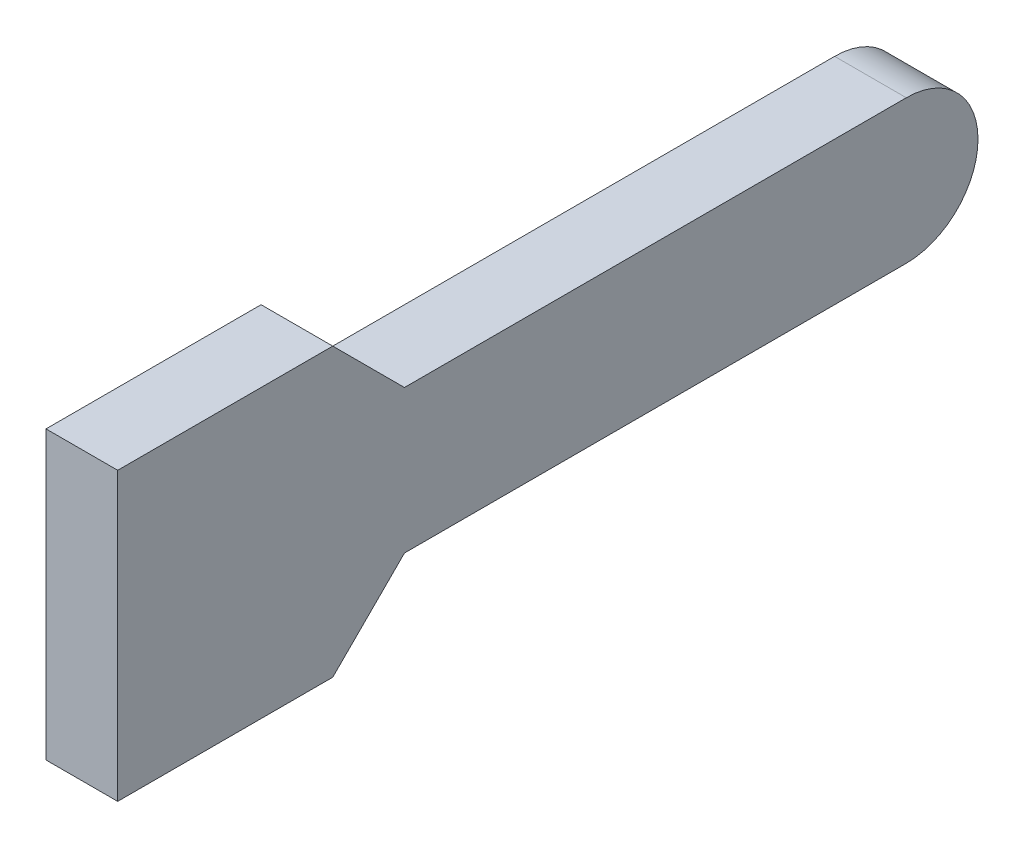
ISO-10303-21;
HEADER;
FILE_DESCRIPTION(('STEP AP214'),'2;1');
FILE_NAME('part.step','',(''),(''),'','','');
FILE_SCHEMA(('AUTOMOTIVE_DESIGN { 1 0 10303 214 1 1 1 1 }'));
ENDSEC;
DATA;
#1=APPLICATION_CONTEXT('core data for automotive mechanical design processes');
#2=APPLICATION_PROTOCOL_DEFINITION('international standard','automotive_design',2000,#1);
#3=PRODUCT_CONTEXT('',#1,'mechanical');
#4=PRODUCT('Part','Part','',(#3));
#5=PRODUCT_RELATED_PRODUCT_CATEGORY('part','',(#4));
#6=PRODUCT_DEFINITION_FORMATION('','',#4);
#7=PRODUCT_DEFINITION_CONTEXT('part definition',#1,'design');
#8=PRODUCT_DEFINITION('design','',#6,#7);
#9=PRODUCT_DEFINITION_SHAPE('','',#8);
#10=(LENGTH_UNIT() NAMED_UNIT(*) SI_UNIT(.MILLI.,.METRE.));
#11=(NAMED_UNIT(*) PLANE_ANGLE_UNIT() SI_UNIT($,.RADIAN.));
#12=(NAMED_UNIT(*) SI_UNIT($,.STERADIAN.) SOLID_ANGLE_UNIT());
#13=UNCERTAINTY_MEASURE_WITH_UNIT(LENGTH_MEASURE(1.E-05),#10,'distance_accuracy_value','');
#14=(GEOMETRIC_REPRESENTATION_CONTEXT(3) GLOBAL_UNCERTAINTY_ASSIGNED_CONTEXT((#13)) GLOBAL_UNIT_ASSIGNED_CONTEXT((#10,
#11,#12)) REPRESENTATION_CONTEXT('',''));
#15=CARTESIAN_POINT('',(0.,0.,0.));
#16=DIRECTION('',(0.,0.,1.));
#17=DIRECTION('',(1.,0.,0.));
#18=AXIS2_PLACEMENT_3D('',#15,#16,#17);
#19=CARTESIAN_POINT('',(-0.25,0.,-1.67367553520706));
#20=DIRECTION('',(1.,0.,0.));
#21=DIRECTION('',(0.,0.,-1.));
#22=AXIS2_PLACEMENT_3D('',#19,#20,#21);
#23=PLANE('',#22);
#24=DIRECTION('',(0.,0.,-1.));
#25=VECTOR('',#24,1.);
#26=CARTESIAN_POINT('',(-0.25,-1.,-0.500000000000001));
#27=LINE('',#26,#25);
#28=CARTESIAN_POINT('',(-0.25,-1.,1.));
#29=VERTEX_POINT('',#28);
#30=CARTESIAN_POINT('',(-0.25,-1.,-0.500000000000001));
#31=VERTEX_POINT('',#30);
#32=EDGE_CURVE('E145',#29,#31,#27,.T.);
#33=ORIENTED_EDGE('',*,*,#32,.F.);
#34=DIRECTION('',(0.,1.,0.));
#35=VECTOR('',#34,1.);
#36=CARTESIAN_POINT('',(-0.25,-1.,1.));
#37=LINE('',#36,#35);
#38=CARTESIAN_POINT('',(-0.25,1.,1.));
#39=VERTEX_POINT('',#38);
#40=EDGE_CURVE('E158',#39,#29,#37,.F.);
#41=ORIENTED_EDGE('',*,*,#40,.F.);
#42=DIRECTION('',(0.,0.,-1.));
#43=VECTOR('',#42,1.);
#44=CARTESIAN_POINT('',(-0.25,1.,-1.67367553520706));
#45=LINE('',#44,#43);
#46=CARTESIAN_POINT('',(-0.25,1.,-0.500000000000001));
#47=VERTEX_POINT('',#46);
#48=EDGE_CURVE('E175',#47,#39,#45,.F.);
#49=ORIENTED_EDGE('',*,*,#48,.F.);
#50=DIRECTION('',(0.,0.707106781186547,0.707106781186548));
#51=VECTOR('',#50,1.);
#52=CARTESIAN_POINT('',(-0.25,0.5,-1.));
#53=LINE('',#52,#51);
#54=CARTESIAN_POINT('',(-0.25,0.5,-1.));
#55=VERTEX_POINT('',#54);
#56=EDGE_CURVE('E98',#55,#47,#53,.T.);
#57=ORIENTED_EDGE('',*,*,#56,.F.);
#58=DIRECTION('',(0.,0.,1.));
#59=VECTOR('',#58,1.);
#60=CARTESIAN_POINT('',(-0.25,0.5,-1.));
#61=LINE('',#60,#59);
#62=CARTESIAN_POINT('',(-0.25,0.5,-4.5));
#63=VERTEX_POINT('',#62);
#64=EDGE_CURVE('E95',#63,#55,#61,.T.);
#65=ORIENTED_EDGE('',*,*,#64,.F.);
#66=CARTESIAN_POINT('',(-0.25,0.,-4.5));
#67=DIRECTION('',(1.,0.,0.));
#68=DIRECTION('',(0.,0.,-1.));
#69=AXIS2_PLACEMENT_3D('',#66,#67,#68);
#70=CIRCLE('',#69,0.5);
#71=CARTESIAN_POINT('',(-0.25,-0.5,-4.5));
#72=VERTEX_POINT('',#71);
#73=EDGE_CURVE('E20',#72,#63,#70,.T.);
#74=ORIENTED_EDGE('',*,*,#73,.F.);
#75=DIRECTION('',(0.,0.,-1.));
#76=VECTOR('',#75,1.);
#77=CARTESIAN_POINT('',(-0.25,-0.5,-4.5));
#78=LINE('',#77,#76);
#79=CARTESIAN_POINT('',(-0.25,-0.5,-1.));
#80=VERTEX_POINT('',#79);
#81=EDGE_CURVE('E80',#80,#72,#78,.T.);
#82=ORIENTED_EDGE('',*,*,#81,.F.);
#83=DIRECTION('',(0.,0.707106781186548,-0.707106781186547));
#84=VECTOR('',#83,1.);
#85=CARTESIAN_POINT('',(-0.25,-0.5,-1.));
#86=LINE('',#85,#84);
#87=EDGE_CURVE('E131',#31,#80,#86,.T.);
#88=ORIENTED_EDGE('',*,*,#87,.F.);
#89=EDGE_LOOP('',(#33,#41,#49,#57,#65,#74,#82,#88));
#90=FACE_BOUND('',#89,.T.);
#91=ADVANCED_FACE('F17',(#90),#23,.F.);
#92=CARTESIAN_POINT('',(0.,-1.,1.));
#93=DIRECTION('',(0.,0.,1.));
#94=DIRECTION('',(1.,0.,0.));
#95=AXIS2_PLACEMENT_3D('',#92,#93,#94);
#96=PLANE('',#95);
#97=ORIENTED_EDGE('',*,*,#40,.T.);
#98=DIRECTION('',(1.,0.,0.));
#99=VECTOR('',#98,1.);
#100=CARTESIAN_POINT('',(0.,-1.,1.));
#101=LINE('',#100,#99);
#102=CARTESIAN_POINT('',(0.25,-1.,1.));
#103=VERTEX_POINT('',#102);
#104=EDGE_CURVE('E154',#103,#29,#101,.F.);
#105=ORIENTED_EDGE('',*,*,#104,.F.);
#106=DIRECTION('',(0.,1.,0.));
#107=VECTOR('',#106,1.);
#108=CARTESIAN_POINT('',(0.25,0.,1.));
#109=LINE('',#108,#107);
#110=CARTESIAN_POINT('',(0.25,1.,1.));
#111=VERTEX_POINT('',#110);
#112=EDGE_CURVE('E151',#111,#103,#109,.F.);
#113=ORIENTED_EDGE('',*,*,#112,.F.);
#114=DIRECTION('',(1.,0.,0.));
#115=VECTOR('',#114,1.);
#116=CARTESIAN_POINT('',(0.,1.,1.));
#117=LINE('',#116,#115);
#118=EDGE_CURVE('E164',#39,#111,#117,.T.);
#119=ORIENTED_EDGE('',*,*,#118,.F.);
#120=EDGE_LOOP('',(#97,#105,#113,#119));
#121=FACE_BOUND('',#120,.T.);
#122=ADVANCED_FACE('F225',(#121),#96,.T.);
#123=CARTESIAN_POINT('',(0.,-1.,-0.500000000000001));
#124=DIRECTION('',(0.,-1.,0.));
#125=DIRECTION('',(0.,0.,-1.));
#126=AXIS2_PLACEMENT_3D('',#123,#124,#125);
#127=PLANE('',#126);
#128=ORIENTED_EDGE('',*,*,#32,.T.);
#129=DIRECTION('',(1.,0.,0.));
#130=VECTOR('',#129,1.);
#131=CARTESIAN_POINT('',(0.,-1.,-0.500000000000001));
#132=LINE('',#131,#130);
#133=CARTESIAN_POINT('',(0.25,-1.,-0.500000000000001));
#134=VERTEX_POINT('',#133);
#135=EDGE_CURVE('E142',#134,#31,#132,.F.);
#136=ORIENTED_EDGE('',*,*,#135,.F.);
#137=DIRECTION('',(0.,0.,-1.));
#138=VECTOR('',#137,1.);
#139=CARTESIAN_POINT('',(0.25,-1.,-1.67367553520706));
#140=LINE('',#139,#138);
#141=EDGE_CURVE('E139',#103,#134,#140,.T.);
#142=ORIENTED_EDGE('',*,*,#141,.F.);
#143=ORIENTED_EDGE('',*,*,#104,.T.);
#144=EDGE_LOOP('',(#128,#136,#142,#143));
#145=FACE_BOUND('',#144,.T.);
#146=ADVANCED_FACE('F223',(#145),#127,.T.);
#147=CARTESIAN_POINT('',(0.,-0.5,-1.));
#148=DIRECTION('',(0.,-0.707106781186547,-0.707106781186548));
#149=DIRECTION('',(0.,0.707106781186548,-0.707106781186547));
#150=AXIS2_PLACEMENT_3D('',#147,#148,#149);
#151=PLANE('',#150);
#152=ORIENTED_EDGE('',*,*,#87,.T.);
#153=DIRECTION('',(1.,0.,0.));
#154=VECTOR('',#153,1.);
#155=CARTESIAN_POINT('',(0.,-0.5,-1.));
#156=LINE('',#155,#154);
#157=CARTESIAN_POINT('',(0.25,-0.5,-1.));
#158=VERTEX_POINT('',#157);
#159=EDGE_CURVE('E128',#158,#80,#156,.F.);
#160=ORIENTED_EDGE('',*,*,#159,.F.);
#161=DIRECTION('',(0.,0.707106781186548,-0.707106781186547));
#162=VECTOR('',#161,1.);
#163=CARTESIAN_POINT('',(0.25,-1.,-0.500000000000001));
#164=LINE('',#163,#162);
#165=EDGE_CURVE('E134',#134,#158,#164,.T.);
#166=ORIENTED_EDGE('',*,*,#165,.F.);
#167=ORIENTED_EDGE('',*,*,#135,.T.);
#168=EDGE_LOOP('',(#152,#160,#166,#167));
#169=FACE_BOUND('',#168,.T.);
#170=ADVANCED_FACE('F217',(#169),#151,.T.);
#171=CARTESIAN_POINT('',(0.,-0.5,-4.5));
#172=DIRECTION('',(0.,-1.,0.));
#173=DIRECTION('',(0.,0.,-1.));
#174=AXIS2_PLACEMENT_3D('',#171,#172,#173);
#175=PLANE('',#174);
#176=ORIENTED_EDGE('',*,*,#81,.T.);
#177=DIRECTION('',(1.,0.,0.));
#178=VECTOR('',#177,1.);
#179=CARTESIAN_POINT('',(0.,-0.5,-4.5));
#180=LINE('',#179,#178);
#181=CARTESIAN_POINT('',(0.25,-0.5,-4.5));
#182=VERTEX_POINT('',#181);
#183=EDGE_CURVE('E91',#182,#72,#180,.F.);
#184=ORIENTED_EDGE('',*,*,#183,.F.);
#185=DIRECTION('',(0.,0.,-1.));
#186=VECTOR('',#185,1.);
#187=CARTESIAN_POINT('',(0.25,-0.5,-1.67367553520706));
#188=LINE('',#187,#186);
#189=EDGE_CURVE('E138',#158,#182,#188,.T.);
#190=ORIENTED_EDGE('',*,*,#189,.F.);
#191=ORIENTED_EDGE('',*,*,#159,.T.);
#192=EDGE_LOOP('',(#176,#184,#190,#191));
#193=FACE_BOUND('',#192,.T.);
#194=ADVANCED_FACE('F215',(#193),#175,.T.);
#195=CARTESIAN_POINT('',(0.,0.,-4.5));
#196=DIRECTION('',(1.,0.,0.));
#197=DIRECTION('',(0.,0.,-1.));
#198=AXIS2_PLACEMENT_3D('',#195,#196,#197);
#199=CYLINDRICAL_SURFACE('',#198,0.5);
#200=ORIENTED_EDGE('',*,*,#73,.T.);
#201=DIRECTION('',(1.,0.,0.));
#202=VECTOR('',#201,1.);
#203=CARTESIAN_POINT('',(0.,0.5,-4.5));
#204=LINE('',#203,#202);
#205=CARTESIAN_POINT('',(0.25,0.5,-4.5));
#206=VERTEX_POINT('',#205);
#207=EDGE_CURVE('E89',#206,#63,#204,.F.);
#208=ORIENTED_EDGE('',*,*,#207,.F.);
#209=CARTESIAN_POINT('',(0.25,0.,-4.5));
#210=DIRECTION('',(1.,0.,0.));
#211=DIRECTION('',(0.,0.,-1.));
#212=AXIS2_PLACEMENT_3D('',#209,#210,#211);
#213=CIRCLE('',#212,0.5);
#214=EDGE_CURVE('E203',#182,#206,#213,.T.);
#215=ORIENTED_EDGE('',*,*,#214,.F.);
#216=ORIENTED_EDGE('',*,*,#183,.T.);
#217=EDGE_LOOP('',(#200,#208,#215,#216));
#218=FACE_BOUND('',#217,.T.);
#219=ADVANCED_FACE('F86',(#218),#199,.T.);
#220=CARTESIAN_POINT('',(0.,0.5,-1.));
#221=DIRECTION('',(0.,1.,0.));
#222=DIRECTION('',(0.,0.,1.));
#223=AXIS2_PLACEMENT_3D('',#220,#221,#222);
#224=PLANE('',#223);
#225=ORIENTED_EDGE('',*,*,#64,.T.);
#226=DIRECTION('',(1.,0.,0.));
#227=VECTOR('',#226,1.);
#228=CARTESIAN_POINT('',(0.,0.5,-1.));
#229=LINE('',#228,#227);
#230=CARTESIAN_POINT('',(0.25,0.5,-1.));
#231=VERTEX_POINT('',#230);
#232=EDGE_CURVE('E102',#231,#55,#229,.F.);
#233=ORIENTED_EDGE('',*,*,#232,.F.);
#234=DIRECTION('',(0.,0.,-1.));
#235=VECTOR('',#234,1.);
#236=CARTESIAN_POINT('',(0.25,0.5,-1.67367553520706));
#237=LINE('',#236,#235);
#238=EDGE_CURVE('E106',#206,#231,#237,.F.);
#239=ORIENTED_EDGE('',*,*,#238,.F.);
#240=ORIENTED_EDGE('',*,*,#207,.T.);
#241=EDGE_LOOP('',(#225,#233,#239,#240));
#242=FACE_BOUND('',#241,.T.);
#243=ADVANCED_FACE('F104',(#242),#224,.T.);
#244=CARTESIAN_POINT('',(0.,1.,-0.500000000000001));
#245=DIRECTION('',(0.,0.707106781186547,-0.707106781186548));
#246=DIRECTION('',(0.,0.707106781186548,0.707106781186547));
#247=AXIS2_PLACEMENT_3D('',#244,#245,#246);
#248=PLANE('',#247);
#249=ORIENTED_EDGE('',*,*,#56,.T.);
#250=DIRECTION('',(1.,0.,0.));
#251=VECTOR('',#250,1.);
#252=CARTESIAN_POINT('',(0.,1.,-0.500000000000001));
#253=LINE('',#252,#251);
#254=CARTESIAN_POINT('',(0.25,1.,-0.500000000000001));
#255=VERTEX_POINT('',#254);
#256=EDGE_CURVE('E36',#255,#47,#253,.F.);
#257=ORIENTED_EDGE('',*,*,#256,.F.);
#258=DIRECTION('',(0.,0.707106781186547,0.707106781186548));
#259=VECTOR('',#258,1.);
#260=CARTESIAN_POINT('',(0.25,0.5,-1.));
#261=LINE('',#260,#259);
#262=EDGE_CURVE('E27',#231,#255,#261,.T.);
#263=ORIENTED_EDGE('',*,*,#262,.F.);
#264=ORIENTED_EDGE('',*,*,#232,.T.);
#265=EDGE_LOOP('',(#249,#257,#263,#264));
#266=FACE_BOUND('',#265,.T.);
#267=ADVANCED_FACE('F228',(#266),#248,.T.);
#268=CARTESIAN_POINT('',(0.,1.,1.));
#269=DIRECTION('',(0.,1.,0.));
#270=DIRECTION('',(0.,0.,1.));
#271=AXIS2_PLACEMENT_3D('',#268,#269,#270);
#272=PLANE('',#271);
#273=ORIENTED_EDGE('',*,*,#48,.T.);
#274=ORIENTED_EDGE('',*,*,#118,.T.);
#275=DIRECTION('',(0.,0.,-1.));
#276=VECTOR('',#275,1.);
#277=CARTESIAN_POINT('',(0.25,1.,-1.67367553520706));
#278=LINE('',#277,#276);
#279=EDGE_CURVE('E11',#255,#111,#278,.F.);
#280=ORIENTED_EDGE('',*,*,#279,.F.);
#281=ORIENTED_EDGE('',*,*,#256,.T.);
#282=EDGE_LOOP('',(#273,#274,#280,#281));
#283=FACE_BOUND('',#282,.T.);
#284=ADVANCED_FACE('F227',(#283),#272,.T.);
#285=CARTESIAN_POINT('',(0.25,0.,-1.67367553520706));
#286=DIRECTION('',(1.,0.,0.));
#287=DIRECTION('',(0.,0.,-1.));
#288=AXIS2_PLACEMENT_3D('',#285,#286,#287);
#289=PLANE('',#288);
#290=ORIENTED_EDGE('',*,*,#262,.T.);
#291=ORIENTED_EDGE('',*,*,#279,.T.);
#292=ORIENTED_EDGE('',*,*,#112,.T.);
#293=ORIENTED_EDGE('',*,*,#141,.T.);
#294=ORIENTED_EDGE('',*,*,#165,.T.);
#295=ORIENTED_EDGE('',*,*,#189,.T.);
#296=ORIENTED_EDGE('',*,*,#214,.T.);
#297=ORIENTED_EDGE('',*,*,#238,.T.);
#298=EDGE_LOOP('',(#290,#291,#292,#293,#294,#295,#296,#297));
#299=FACE_BOUND('',#298,.T.);
#300=ADVANCED_FACE('F213',(#299),#289,.T.);
#301=CLOSED_SHELL('',(#91,#122,#146,#170,#194,#219,#243,#267,#284,#300));
#302=MANIFOLD_SOLID_BREP('B1',#301);
#303=ADVANCED_BREP_SHAPE_REPRESENTATION('',(#18,#302),#14);
#304=SHAPE_DEFINITION_REPRESENTATION(#9,#303);
ENDSEC;
END-ISO-10303-21;
